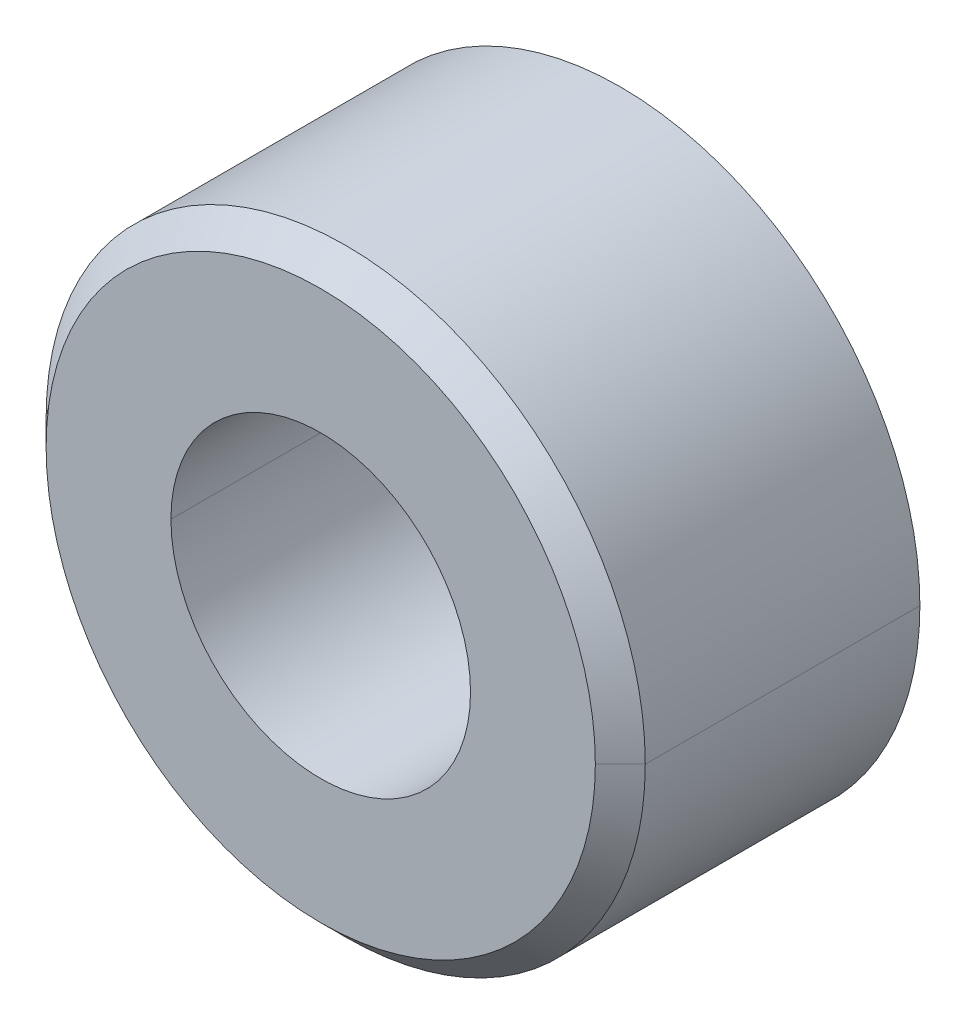
ISO-10303-21;
HEADER;
FILE_DESCRIPTION(('STEP AP214'),'2;1');
FILE_NAME('part.step','',(''),(''),'','','');
FILE_SCHEMA(('AUTOMOTIVE_DESIGN { 1 0 10303 214 1 1 1 1 }'));
ENDSEC;
DATA;
#1=APPLICATION_CONTEXT('core data for automotive mechanical design processes');
#2=APPLICATION_PROTOCOL_DEFINITION('international standard','automotive_design',2000,#1);
#3=PRODUCT_CONTEXT('',#1,'mechanical');
#4=PRODUCT('Part','Part','',(#3));
#5=PRODUCT_RELATED_PRODUCT_CATEGORY('part','',(#4));
#6=PRODUCT_DEFINITION_FORMATION('','',#4);
#7=PRODUCT_DEFINITION_CONTEXT('part definition',#1,'design');
#8=PRODUCT_DEFINITION('design','',#6,#7);
#9=PRODUCT_DEFINITION_SHAPE('','',#8);
#10=(LENGTH_UNIT() NAMED_UNIT(*) SI_UNIT(.MILLI.,.METRE.));
#11=(NAMED_UNIT(*) PLANE_ANGLE_UNIT() SI_UNIT($,.RADIAN.));
#12=(NAMED_UNIT(*) SI_UNIT($,.STERADIAN.) SOLID_ANGLE_UNIT());
#13=UNCERTAINTY_MEASURE_WITH_UNIT(LENGTH_MEASURE(1.E-05),#10,'distance_accuracy_value','');
#14=(GEOMETRIC_REPRESENTATION_CONTEXT(3) GLOBAL_UNCERTAINTY_ASSIGNED_CONTEXT((#13)) GLOBAL_UNIT_ASSIGNED_CONTEXT((#10,
#11,#12)) REPRESENTATION_CONTEXT('',''));
#15=CARTESIAN_POINT('',(0.,0.,0.));
#16=DIRECTION('',(0.,0.,1.));
#17=DIRECTION('',(1.,0.,0.));
#18=AXIS2_PLACEMENT_3D('',#15,#16,#17);
#19=CARTESIAN_POINT('',(0.,0.,6.));
#20=DIRECTION('',(0.,0.,-1.));
#21=DIRECTION('',(-1.,0.,0.));
#22=AXIS2_PLACEMENT_3D('',#19,#20,#21);
#23=CONICAL_SURFACE('',#22,5.5,0.785398163397448);
#24=DIRECTION('',(0.707106781186547,0.,-0.707106781186548));
#25=VECTOR('',#24,1.);
#26=CARTESIAN_POINT('',(5.5,0.,6.));
#27=LINE('',#26,#25);
#28=CARTESIAN_POINT('',(5.5,0.,6.));
#29=VERTEX_POINT('',#28);
#30=CARTESIAN_POINT('',(6.,0.,5.5));
#31=VERTEX_POINT('',#30);
#32=EDGE_CURVE('E83',#29,#31,#27,.T.);
#33=ORIENTED_EDGE('',*,*,#32,.F.);
#34=CARTESIAN_POINT('',(0.,0.,6.));
#35=DIRECTION('',(0.,0.,1.));
#36=DIRECTION('',(1.,0.,0.));
#37=AXIS2_PLACEMENT_3D('',#34,#35,#36);
#38=CIRCLE('',#37,5.5);
#39=CARTESIAN_POINT('',(-5.5,0.,6.));
#40=VERTEX_POINT('',#39);
#41=EDGE_CURVE('E78',#40,#29,#38,.T.);
#42=ORIENTED_EDGE('',*,*,#41,.F.);
#43=DIRECTION('',(-0.707106781186547,0.,-0.707106781186548));
#44=VECTOR('',#43,1.);
#45=CARTESIAN_POINT('',(-5.5,0.,6.));
#46=LINE('',#45,#44);
#47=CARTESIAN_POINT('',(-6.,0.,5.5));
#48=VERTEX_POINT('',#47);
#49=EDGE_CURVE('E80',#40,#48,#46,.T.);
#50=ORIENTED_EDGE('',*,*,#49,.T.);
#51=CARTESIAN_POINT('',(0.,0.,5.5));
#52=DIRECTION('',(0.,0.,-1.));
#53=DIRECTION('',(1.,0.,0.));
#54=AXIS2_PLACEMENT_3D('',#51,#52,#53);
#55=CIRCLE('',#54,6.);
#56=EDGE_CURVE('E11',#31,#48,#55,.T.);
#57=ORIENTED_EDGE('',*,*,#56,.F.);
#58=EDGE_LOOP('',(#33,#42,#50,#57));
#59=FACE_BOUND('',#58,.T.);
#60=ADVANCED_FACE('F17',(#59),#23,.T.);
#61=CARTESIAN_POINT('',(0.,0.,6.));
#62=DIRECTION('',(0.,0.,-1.));
#63=DIRECTION('',(-1.,0.,0.));
#64=AXIS2_PLACEMENT_3D('',#61,#62,#63);
#65=CYLINDRICAL_SURFACE('',#64,3.);
#66=DIRECTION('',(0.,0.,-1.));
#67=VECTOR('',#66,1.);
#68=CARTESIAN_POINT('',(3.,0.,6.));
#69=LINE('',#68,#67);
#70=CARTESIAN_POINT('',(3.,0.,6.));
#71=VERTEX_POINT('',#70);
#72=CARTESIAN_POINT('',(3.,0.,0.));
#73=VERTEX_POINT('',#72);
#74=EDGE_CURVE('E137',#71,#73,#69,.T.);
#75=ORIENTED_EDGE('',*,*,#74,.F.);
#76=CARTESIAN_POINT('',(0.,0.,6.));
#77=DIRECTION('',(0.,0.,1.));
#78=DIRECTION('',(1.,0.,0.));
#79=AXIS2_PLACEMENT_3D('',#76,#77,#78);
#80=CIRCLE('',#79,3.);
#81=CARTESIAN_POINT('',(-3.,0.,6.));
#82=VERTEX_POINT('',#81);
#83=EDGE_CURVE('E88',#71,#82,#80,.T.);
#84=ORIENTED_EDGE('',*,*,#83,.T.);
#85=DIRECTION('',(0.,0.,-1.));
#86=VECTOR('',#85,1.);
#87=CARTESIAN_POINT('',(-3.,0.,6.));
#88=LINE('',#87,#86);
#89=CARTESIAN_POINT('',(-3.,0.,0.));
#90=VERTEX_POINT('',#89);
#91=EDGE_CURVE('E111',#82,#90,#88,.T.);
#92=ORIENTED_EDGE('',*,*,#91,.T.);
#93=CARTESIAN_POINT('',(0.,0.,0.));
#94=DIRECTION('',(0.,0.,1.));
#95=DIRECTION('',(1.,0.,0.));
#96=AXIS2_PLACEMENT_3D('',#93,#94,#95);
#97=CIRCLE('',#96,3.);
#98=EDGE_CURVE('E28',#73,#90,#97,.T.);
#99=ORIENTED_EDGE('',*,*,#98,.F.);
#100=EDGE_LOOP('',(#75,#84,#92,#99));
#101=FACE_BOUND('',#100,.T.);
#102=ADVANCED_FACE('F155',(#101),#65,.F.);
#103=CARTESIAN_POINT('',(0.,0.,6.));
#104=DIRECTION('',(0.,0.,-1.));
#105=DIRECTION('',(-1.,0.,0.));
#106=AXIS2_PLACEMENT_3D('',#103,#104,#105);
#107=CYLINDRICAL_SURFACE('',#106,6.);
#108=DIRECTION('',(0.,0.,-1.));
#109=VECTOR('',#108,1.);
#110=CARTESIAN_POINT('',(6.,0.,6.));
#111=LINE('',#110,#109);
#112=CARTESIAN_POINT('',(6.,0.,0.));
#113=VERTEX_POINT('',#112);
#114=EDGE_CURVE('E114',#31,#113,#111,.T.);
#115=ORIENTED_EDGE('',*,*,#114,.F.);
#116=ORIENTED_EDGE('',*,*,#56,.T.);
#117=DIRECTION('',(0.,0.,-1.));
#118=VECTOR('',#117,1.);
#119=CARTESIAN_POINT('',(-6.,0.,6.));
#120=LINE('',#119,#118);
#121=CARTESIAN_POINT('',(-6.,0.,0.));
#122=VERTEX_POINT('',#121);
#123=EDGE_CURVE('E89',#48,#122,#120,.T.);
#124=ORIENTED_EDGE('',*,*,#123,.T.);
#125=CARTESIAN_POINT('',(0.,0.,0.));
#126=DIRECTION('',(0.,0.,1.));
#127=DIRECTION('',(1.,0.,0.));
#128=AXIS2_PLACEMENT_3D('',#125,#126,#127);
#129=CIRCLE('',#128,6.);
#130=EDGE_CURVE('E42',#122,#113,#129,.T.);
#131=ORIENTED_EDGE('',*,*,#130,.T.);
#132=EDGE_LOOP('',(#115,#116,#124,#131));
#133=FACE_BOUND('',#132,.T.);
#134=ADVANCED_FACE('F203',(#133),#107,.T.);
#135=CARTESIAN_POINT('',(0.,0.,0.));
#136=DIRECTION('',(0.,0.,1.));
#137=DIRECTION('',(1.,0.,0.));
#138=AXIS2_PLACEMENT_3D('',#135,#136,#137);
#139=PLANE('',#138);
#140=CARTESIAN_POINT('',(0.,0.,0.));
#141=DIRECTION('',(0.,0.,1.));
#142=DIRECTION('',(1.,0.,0.));
#143=AXIS2_PLACEMENT_3D('',#140,#141,#142);
#144=CIRCLE('',#143,3.);
#145=EDGE_CURVE('E109',#90,#73,#144,.T.);
#146=ORIENTED_EDGE('',*,*,#145,.T.);
#147=ORIENTED_EDGE('',*,*,#98,.T.);
#148=EDGE_LOOP('',(#146,#147));
#149=FACE_BOUND('',#148,.T.);
#150=ORIENTED_EDGE('',*,*,#130,.F.);
#151=CARTESIAN_POINT('',(0.,0.,0.));
#152=DIRECTION('',(0.,0.,1.));
#153=DIRECTION('',(1.,0.,0.));
#154=AXIS2_PLACEMENT_3D('',#151,#152,#153);
#155=CIRCLE('',#154,6.);
#156=EDGE_CURVE('E21',#113,#122,#155,.T.);
#157=ORIENTED_EDGE('',*,*,#156,.F.);
#158=EDGE_LOOP('',(#150,#157));
#159=FACE_BOUND('',#158,.T.);
#160=ADVANCED_FACE('F158',(#149,#159),#139,.F.);
#161=CARTESIAN_POINT('',(0.,0.,6.));
#162=DIRECTION('',(0.,0.,1.));
#163=DIRECTION('',(1.,0.,0.));
#164=AXIS2_PLACEMENT_3D('',#161,#162,#163);
#165=PLANE('',#164);
#166=CARTESIAN_POINT('',(0.,0.,6.));
#167=DIRECTION('',(0.,0.,1.));
#168=DIRECTION('',(1.,0.,0.));
#169=AXIS2_PLACEMENT_3D('',#166,#167,#168);
#170=CIRCLE('',#169,3.);
#171=EDGE_CURVE('E97',#82,#71,#170,.T.);
#172=ORIENTED_EDGE('',*,*,#171,.F.);
#173=ORIENTED_EDGE('',*,*,#83,.F.);
#174=EDGE_LOOP('',(#172,#173));
#175=FACE_BOUND('',#174,.T.);
#176=ORIENTED_EDGE('',*,*,#41,.T.);
#177=CARTESIAN_POINT('',(0.,0.,6.));
#178=DIRECTION('',(0.,0.,1.));
#179=DIRECTION('',(1.,0.,0.));
#180=AXIS2_PLACEMENT_3D('',#177,#178,#179);
#181=CIRCLE('',#180,5.5);
#182=EDGE_CURVE('E93',#29,#40,#181,.T.);
#183=ORIENTED_EDGE('',*,*,#182,.T.);
#184=EDGE_LOOP('',(#176,#183));
#185=FACE_BOUND('',#184,.T.);
#186=ADVANCED_FACE('F19',(#175,#185),#165,.T.);
#187=CARTESIAN_POINT('',(0.,0.,6.));
#188=DIRECTION('',(0.,0.,-1.));
#189=DIRECTION('',(-1.,0.,0.));
#190=AXIS2_PLACEMENT_3D('',#187,#188,#189);
#191=CYLINDRICAL_SURFACE('',#190,6.);
#192=CARTESIAN_POINT('',(0.,0.,5.5));
#193=DIRECTION('',(0.,0.,-1.));
#194=DIRECTION('',(1.,0.,0.));
#195=AXIS2_PLACEMENT_3D('',#192,#193,#194);
#196=CIRCLE('',#195,6.);
#197=EDGE_CURVE('E95',#48,#31,#196,.T.);
#198=ORIENTED_EDGE('',*,*,#197,.T.);
#199=ORIENTED_EDGE('',*,*,#114,.T.);
#200=ORIENTED_EDGE('',*,*,#156,.T.);
#201=ORIENTED_EDGE('',*,*,#123,.F.);
#202=EDGE_LOOP('',(#198,#199,#200,#201));
#203=FACE_BOUND('',#202,.T.);
#204=ADVANCED_FACE('F195',(#203),#191,.T.);
#205=CARTESIAN_POINT('',(0.,0.,6.));
#206=DIRECTION('',(0.,0.,-1.));
#207=DIRECTION('',(-1.,0.,0.));
#208=AXIS2_PLACEMENT_3D('',#205,#206,#207);
#209=CYLINDRICAL_SURFACE('',#208,3.);
#210=ORIENTED_EDGE('',*,*,#171,.T.);
#211=ORIENTED_EDGE('',*,*,#74,.T.);
#212=ORIENTED_EDGE('',*,*,#145,.F.);
#213=ORIENTED_EDGE('',*,*,#91,.F.);
#214=EDGE_LOOP('',(#210,#211,#212,#213));
#215=FACE_BOUND('',#214,.T.);
#216=ADVANCED_FACE('F150',(#215),#209,.F.);
#217=CARTESIAN_POINT('',(0.,0.,6.));
#218=DIRECTION('',(0.,0.,-1.));
#219=DIRECTION('',(-1.,0.,0.));
#220=AXIS2_PLACEMENT_3D('',#217,#218,#219);
#221=CONICAL_SURFACE('',#220,5.5,0.785398163397448);
#222=ORIENTED_EDGE('',*,*,#182,.F.);
#223=ORIENTED_EDGE('',*,*,#32,.T.);
#224=ORIENTED_EDGE('',*,*,#197,.F.);
#225=ORIENTED_EDGE('',*,*,#49,.F.);
#226=EDGE_LOOP('',(#222,#223,#224,#225));
#227=FACE_BOUND('',#226,.T.);
#228=ADVANCED_FACE('F92',(#227),#221,.T.);
#229=CLOSED_SHELL('',(#60,#102,#134,#160,#186,#204,#216,#228));
#230=MANIFOLD_SOLID_BREP('B1',#229);
#231=ADVANCED_BREP_SHAPE_REPRESENTATION('',(#18,#230),#14);
#232=SHAPE_DEFINITION_REPRESENTATION(#9,#231);
ENDSEC;
END-ISO-10303-21;
